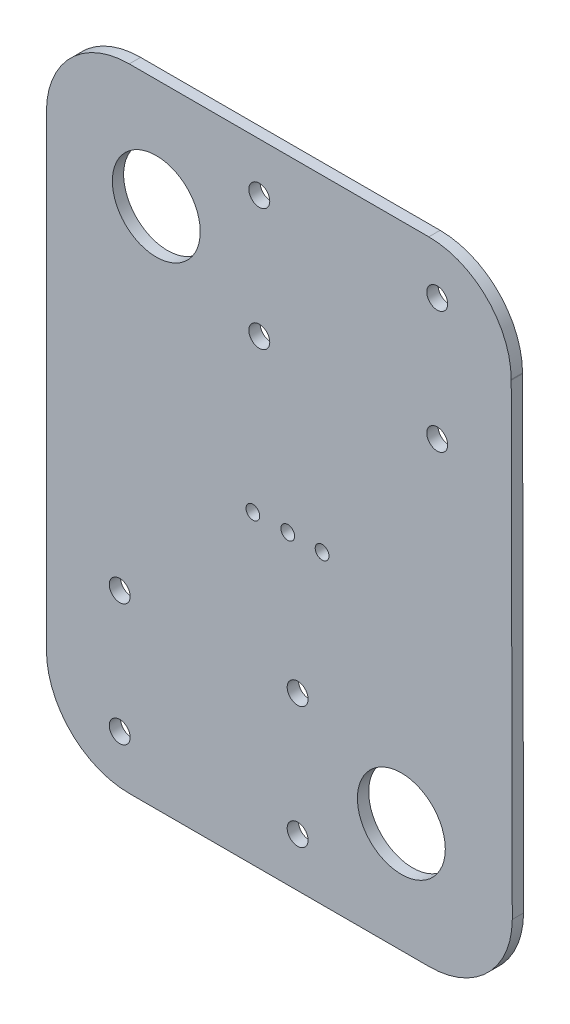
ISO-10303-21;
HEADER;
FILE_DESCRIPTION(('STEP AP214'),'2;1');
FILE_NAME('part.step','',(''),(''),'','','');
FILE_SCHEMA(('AUTOMOTIVE_DESIGN { 1 0 10303 214 1 1 1 1 }'));
ENDSEC;
DATA;
#1=APPLICATION_CONTEXT('core data for automotive mechanical design processes');
#2=APPLICATION_PROTOCOL_DEFINITION('international standard','automotive_design',2000,#1);
#3=PRODUCT_CONTEXT('',#1,'mechanical');
#4=PRODUCT('Part','Part','',(#3));
#5=PRODUCT_RELATED_PRODUCT_CATEGORY('part','',(#4));
#6=PRODUCT_DEFINITION_FORMATION('','',#4);
#7=PRODUCT_DEFINITION_CONTEXT('part definition',#1,'design');
#8=PRODUCT_DEFINITION('design','',#6,#7);
#9=PRODUCT_DEFINITION_SHAPE('','',#8);
#10=(LENGTH_UNIT() NAMED_UNIT(*) SI_UNIT(.MILLI.,.METRE.));
#11=(NAMED_UNIT(*) PLANE_ANGLE_UNIT() SI_UNIT($,.RADIAN.));
#12=(NAMED_UNIT(*) SI_UNIT($,.STERADIAN.) SOLID_ANGLE_UNIT());
#13=UNCERTAINTY_MEASURE_WITH_UNIT(LENGTH_MEASURE(1.E-05),#10,'distance_accuracy_value','');
#14=(GEOMETRIC_REPRESENTATION_CONTEXT(3) GLOBAL_UNCERTAINTY_ASSIGNED_CONTEXT((#13)) GLOBAL_UNIT_ASSIGNED_CONTEXT((#10,
#11,#12)) REPRESENTATION_CONTEXT('',''));
#15=CARTESIAN_POINT('',(0.,0.,0.));
#16=DIRECTION('',(0.,0.,1.));
#17=DIRECTION('',(1.,0.,0.));
#18=AXIS2_PLACEMENT_3D('',#15,#16,#17);
#19=CARTESIAN_POINT('',(16.332373055291,44.01836387923,-0.41148));
#20=DIRECTION('',(0.,0.,-1.));
#21=DIRECTION('',(0.999991562524806,-0.0041079044775982,0.));
#22=AXIS2_PLACEMENT_3D('',#19,#20,#21);
#23=CYLINDRICAL_SURFACE('',#22,3.009651392523);
#24=DIRECTION('',(0.,0.,-1.));
#25=VECTOR('',#24,1.);
#26=CARTESIAN_POINT('',(19.341999053955,44.0307272396701,-0.41148));
#27=LINE('',#26,#25);
#28=CARTESIAN_POINT('',(19.341999053955,44.0307272396701,-0.41148));
#29=VERTEX_POINT('',#28);
#30=CARTESIAN_POINT('',(19.341999053955,44.0307272396701,0.));
#31=VERTEX_POINT('',#30);
#32=EDGE_CURVE('E186',#29,#31,#27,.F.);
#33=ORIENTED_EDGE('',*,*,#32,.F.);
#34=CARTESIAN_POINT('',(16.332373055291,44.01836387923,-0.41148));
#35=DIRECTION('',(0.,0.,1.));
#36=DIRECTION('',(0.999991562524806,-0.0041079044775982,0.));
#37=AXIS2_PLACEMENT_3D('',#34,#35,#36);
#38=CIRCLE('',#37,3.009651392523);
#39=CARTESIAN_POINT('',(16.341999053955,47.02799987793,-0.41148));
#40=VERTEX_POINT('',#39);
#41=EDGE_CURVE('E11',#29,#40,#38,.T.);
#42=ORIENTED_EDGE('',*,*,#41,.T.);
#43=DIRECTION('',(0.,0.,1.));
#44=VECTOR('',#43,1.);
#45=CARTESIAN_POINT('',(16.341999053955,47.02799987793,-0.41148));
#46=LINE('',#45,#44);
#47=CARTESIAN_POINT('',(16.341999053955,47.02799987793,0.));
#48=VERTEX_POINT('',#47);
#49=EDGE_CURVE('E48',#40,#48,#46,.T.);
#50=ORIENTED_EDGE('',*,*,#49,.T.);
#51=CARTESIAN_POINT('',(16.332373055291,44.01836387923,0.));
#52=DIRECTION('',(0.,0.,1.));
#53=DIRECTION('',(0.999991562524806,-0.0041079044775982,0.));
#54=AXIS2_PLACEMENT_3D('',#51,#52,#53);
#55=CIRCLE('',#54,3.009651392523);
#56=EDGE_CURVE('E199',#31,#48,#55,.T.);
#57=ORIENTED_EDGE('',*,*,#56,.F.);
#58=EDGE_LOOP('',(#33,#42,#50,#57));
#59=FACE_BOUND('',#58,.T.);
#60=ADVANCED_FACE('F38',(#59),#23,.T.);
#61=CARTESIAN_POINT('',(16.341999053955,47.02799987793,-0.41148));
#62=DIRECTION('',(0.,-1.,0.));
#63=DIRECTION('',(0.,0.,-1.));
#64=AXIS2_PLACEMENT_3D('',#61,#62,#63);
#65=PLANE('',#64);
#66=DIRECTION('',(-1.,0.,0.));
#67=VECTOR('',#66,1.);
#68=CARTESIAN_POINT('',(16.341999053955,47.02799987793,-0.41148));
#69=LINE('',#68,#67);
#70=CARTESIAN_POINT('',(5.438000202179,47.02799987793,-0.41148));
#71=VERTEX_POINT('',#70);
#72=EDGE_CURVE('E261',#40,#71,#69,.T.);
#73=ORIENTED_EDGE('',*,*,#72,.T.);
#74=DIRECTION('',(0.,0.,1.));
#75=VECTOR('',#74,1.);
#76=CARTESIAN_POINT('',(5.438000202179,47.02799987793,-0.41148));
#77=LINE('',#76,#75);
#78=CARTESIAN_POINT('',(5.438000202179,47.02799987793,0.));
#79=VERTEX_POINT('',#78);
#80=EDGE_CURVE('E264',#71,#79,#77,.T.);
#81=ORIENTED_EDGE('',*,*,#80,.T.);
#82=DIRECTION('',(-1.,0.,0.));
#83=VECTOR('',#82,1.);
#84=CARTESIAN_POINT('',(16.341999053955,47.02799987793,0.));
#85=LINE('',#84,#83);
#86=EDGE_CURVE('E204',#48,#79,#85,.T.);
#87=ORIENTED_EDGE('',*,*,#86,.F.);
#88=ORIENTED_EDGE('',*,*,#49,.F.);
#89=EDGE_LOOP('',(#73,#81,#87,#88));
#90=FACE_BOUND('',#89,.T.);
#91=ADVANCED_FACE('F405',(#90),#65,.F.);
#92=CARTESIAN_POINT('',(5.431629592212,44.018374776933,-0.41148));
#93=DIRECTION('',(0.,0.,-1.));
#94=DIRECTION('',(0.00211674061762714,0.999997759702069,0.));
#95=AXIS2_PLACEMENT_3D('',#92,#93,#94);
#96=CYLINDRICAL_SURFACE('',#95,3.009631843469);
#97=CARTESIAN_POINT('',(5.431629592212,44.018374776933,-0.41148));
#98=DIRECTION('',(0.,0.,1.));
#99=DIRECTION('',(0.00211674061762714,0.999997759702069,0.));
#100=AXIS2_PLACEMENT_3D('',#97,#98,#99);
#101=CIRCLE('',#100,3.009631843469);
#102=CARTESIAN_POINT('',(2.421999931335,44.021999359131,-0.41148));
#103=VERTEX_POINT('',#102);
#104=EDGE_CURVE('E247',#71,#103,#101,.T.);
#105=ORIENTED_EDGE('',*,*,#104,.T.);
#106=DIRECTION('',(0.,0.,1.));
#107=VECTOR('',#106,1.);
#108=CARTESIAN_POINT('',(2.421999931335,44.021999359131,-0.41148));
#109=LINE('',#108,#107);
#110=CARTESIAN_POINT('',(2.421999931335,44.021999359131,0.));
#111=VERTEX_POINT('',#110);
#112=EDGE_CURVE('E244',#103,#111,#109,.T.);
#113=ORIENTED_EDGE('',*,*,#112,.T.);
#114=CARTESIAN_POINT('',(5.431629592212,44.018374776933,0.));
#115=DIRECTION('',(0.,0.,1.));
#116=DIRECTION('',(0.00211674061762714,0.999997759702069,0.));
#117=AXIS2_PLACEMENT_3D('',#114,#115,#116);
#118=CIRCLE('',#117,3.009631843469);
#119=EDGE_CURVE('E206',#79,#111,#118,.T.);
#120=ORIENTED_EDGE('',*,*,#119,.F.);
#121=ORIENTED_EDGE('',*,*,#80,.F.);
#122=EDGE_LOOP('',(#105,#113,#120,#121));
#123=FACE_BOUND('',#122,.T.);
#124=ADVANCED_FACE('F410',(#123),#96,.T.);
#125=CARTESIAN_POINT('',(2.421999931335,44.021999359131,-0.41148));
#126=DIRECTION('',(1.,0.,0.));
#127=DIRECTION('',(0.,1.,0.));
#128=AXIS2_PLACEMENT_3D('',#125,#126,#127);
#129=PLANE('',#128);
#130=DIRECTION('',(0.,-1.,0.));
#131=VECTOR('',#130,1.);
#132=CARTESIAN_POINT('',(2.421999931335,44.021999359131,-0.41148));
#133=LINE('',#132,#131);
#134=CARTESIAN_POINT('',(2.421999931335,27.051000595093,-0.41148));
#135=VERTEX_POINT('',#134);
#136=EDGE_CURVE('E248',#103,#135,#133,.T.);
#137=ORIENTED_EDGE('',*,*,#136,.T.);
#138=DIRECTION('',(0.,0.,1.));
#139=VECTOR('',#138,1.);
#140=CARTESIAN_POINT('',(2.421999931335,27.051000595093,-0.41148));
#141=LINE('',#140,#139);
#142=CARTESIAN_POINT('',(2.421999931335,27.051000595093,0.));
#143=VERTEX_POINT('',#142);
#144=EDGE_CURVE('E224',#135,#143,#141,.T.);
#145=ORIENTED_EDGE('',*,*,#144,.T.);
#146=DIRECTION('',(0.,-1.,0.));
#147=VECTOR('',#146,1.);
#148=CARTESIAN_POINT('',(2.421999931335,44.021999359131,0.));
#149=LINE('',#148,#147);
#150=EDGE_CURVE('E304',#111,#143,#149,.T.);
#151=ORIENTED_EDGE('',*,*,#150,.F.);
#152=ORIENTED_EDGE('',*,*,#112,.F.);
#153=EDGE_LOOP('',(#137,#145,#151,#152));
#154=FACE_BOUND('',#153,.T.);
#155=ADVANCED_FACE('F422',(#154),#129,.F.);
#156=CARTESIAN_POINT('',(5.433336476187,27.03933766917,-0.41148));
#157=DIRECTION('',(0.,0.,-1.));
#158=DIRECTION('',(-0.999992499994815,0.00387297742299429,0.));
#159=AXIS2_PLACEMENT_3D('',#156,#157,#158);
#160=CYLINDRICAL_SURFACE('',#159,3.01135913006);
#161=CARTESIAN_POINT('',(5.433336476187,27.03933766917,-0.41148));
#162=DIRECTION('',(0.,0.,1.));
#163=DIRECTION('',(-0.999992499994815,0.00387297742299429,0.));
#164=AXIS2_PLACEMENT_3D('',#161,#162,#163);
#165=CIRCLE('',#164,3.01135913006);
#166=CARTESIAN_POINT('',(5.421999931335,24.02799987793,-0.41148));
#167=VERTEX_POINT('',#166);
#168=EDGE_CURVE('E221',#135,#167,#165,.T.);
#169=ORIENTED_EDGE('',*,*,#168,.T.);
#170=DIRECTION('',(0.,0.,1.));
#171=VECTOR('',#170,1.);
#172=CARTESIAN_POINT('',(5.421999931335,24.02799987793,-0.41148));
#173=LINE('',#172,#171);
#174=CARTESIAN_POINT('',(5.421999931335,24.02799987793,0.));
#175=VERTEX_POINT('',#174);
#176=EDGE_CURVE('E225',#167,#175,#173,.T.);
#177=ORIENTED_EDGE('',*,*,#176,.T.);
#178=CARTESIAN_POINT('',(5.433336476187,27.03933766917,0.));
#179=DIRECTION('',(0.,0.,1.));
#180=DIRECTION('',(-0.999992499994815,0.00387297742299429,0.));
#181=AXIS2_PLACEMENT_3D('',#178,#179,#180);
#182=CIRCLE('',#181,3.01135913006);
#183=EDGE_CURVE('E306',#143,#175,#182,.T.);
#184=ORIENTED_EDGE('',*,*,#183,.F.);
#185=ORIENTED_EDGE('',*,*,#144,.F.);
#186=EDGE_LOOP('',(#169,#177,#184,#185));
#187=FACE_BOUND('',#186,.T.);
#188=ADVANCED_FACE('F425',(#187),#160,.T.);
#189=CARTESIAN_POINT('',(5.421999931335,24.02799987793,-0.41148));
#190=DIRECTION('',(0.,1.,0.));
#191=DIRECTION('',(1.,0.,0.));
#192=AXIS2_PLACEMENT_3D('',#189,#190,#191);
#193=PLANE('',#192);
#194=DIRECTION('',(1.,0.,0.));
#195=VECTOR('',#194,1.);
#196=CARTESIAN_POINT('',(5.421999931335,24.02799987793,-0.41148));
#197=LINE('',#196,#195);
#198=CARTESIAN_POINT('',(16.341999053955,24.02799987793,-0.41148));
#199=VERTEX_POINT('',#198);
#200=EDGE_CURVE('E219',#167,#199,#197,.T.);
#201=ORIENTED_EDGE('',*,*,#200,.T.);
#202=DIRECTION('',(0.,0.,1.));
#203=VECTOR('',#202,1.);
#204=CARTESIAN_POINT('',(16.341999053955,24.02799987793,-0.41148));
#205=LINE('',#204,#203);
#206=CARTESIAN_POINT('',(16.341999053955,24.02799987793,0.));
#207=VERTEX_POINT('',#206);
#208=EDGE_CURVE('E216',#199,#207,#205,.T.);
#209=ORIENTED_EDGE('',*,*,#208,.T.);
#210=DIRECTION('',(1.,0.,0.));
#211=VECTOR('',#210,1.);
#212=CARTESIAN_POINT('',(5.421999931335,24.02799987793,0.));
#213=LINE('',#212,#211);
#214=EDGE_CURVE('E297',#175,#207,#213,.T.);
#215=ORIENTED_EDGE('',*,*,#214,.F.);
#216=ORIENTED_EDGE('',*,*,#176,.F.);
#217=EDGE_LOOP('',(#201,#209,#215,#216));
#218=FACE_BOUND('',#217,.T.);
#219=ADVANCED_FACE('F459',(#218),#193,.F.);
#220=CARTESIAN_POINT('',(16.360135387178,27.047874592005,-0.41148));
#221=DIRECTION('',(0.,0.,-1.));
#222=DIRECTION('',(-0.00600554919627793,-0.999981966526823,0.));
#223=AXIS2_PLACEMENT_3D('',#220,#221,#222);
#224=CYLINDRICAL_SURFACE('',#223,3.019929173887);
#225=CARTESIAN_POINT('',(16.360135387178,27.047874592005,-0.41148));
#226=DIRECTION('',(0.,0.,1.));
#227=DIRECTION('',(-0.00600554919627793,-0.999981966526823,0.));
#228=AXIS2_PLACEMENT_3D('',#225,#226,#227);
#229=CIRCLE('',#228,3.019929173887);
#230=CARTESIAN_POINT('',(19.379999160767,27.02799987793,-0.41148));
#231=VERTEX_POINT('',#230);
#232=EDGE_CURVE('E220',#199,#231,#229,.T.);
#233=ORIENTED_EDGE('',*,*,#232,.T.);
#234=DIRECTION('',(0.,0.,1.));
#235=VECTOR('',#234,1.);
#236=CARTESIAN_POINT('',(19.379999160767,27.02799987793,-0.41148));
#237=LINE('',#236,#235);
#238=CARTESIAN_POINT('',(19.379999160767,27.02799987793,0.));
#239=VERTEX_POINT('',#238);
#240=EDGE_CURVE('E233',#231,#239,#237,.T.);
#241=ORIENTED_EDGE('',*,*,#240,.T.);
#242=CARTESIAN_POINT('',(16.360135387178,27.047874592005,0.));
#243=DIRECTION('',(0.,0.,1.));
#244=DIRECTION('',(-0.00600554919627793,-0.999981966526823,0.));
#245=AXIS2_PLACEMENT_3D('',#242,#243,#244);
#246=CIRCLE('',#245,3.019929173887);
#247=EDGE_CURVE('E214',#207,#239,#246,.T.);
#248=ORIENTED_EDGE('',*,*,#247,.F.);
#249=ORIENTED_EDGE('',*,*,#208,.F.);
#250=EDGE_LOOP('',(#233,#241,#248,#249));
#251=FACE_BOUND('',#250,.T.);
#252=ADVANCED_FACE('F415',(#251),#224,.T.);
#253=CARTESIAN_POINT('',(5.09069086,25.80836342,-0.41148));
#254=DIRECTION('',(0.,0.,-1.));
#255=DIRECTION('',(1.,0.,0.));
#256=AXIS2_PLACEMENT_3D('',#253,#254,#255);
#257=CYLINDRICAL_SURFACE('',#256,0.381);
#258=DIRECTION('',(0.,0.,1.));
#259=VECTOR('',#258,1.);
#260=CARTESIAN_POINT('',(5.47169086,25.80836342,-0.41148));
#261=LINE('',#260,#259);
#262=CARTESIAN_POINT('',(5.47169086,25.80836342,-0.41148));
#263=VERTEX_POINT('',#262);
#264=CARTESIAN_POINT('',(5.47169086,25.80836342,0.));
#265=VERTEX_POINT('',#264);
#266=EDGE_CURVE('E229',#263,#265,#261,.T.);
#267=ORIENTED_EDGE('',*,*,#266,.T.);
#268=CARTESIAN_POINT('',(5.09069086,25.80836342,0.));
#269=DIRECTION('',(0.,0.,1.));
#270=DIRECTION('',(1.,0.,0.));
#271=AXIS2_PLACEMENT_3D('',#268,#269,#270);
#272=CIRCLE('',#271,0.381);
#273=EDGE_CURVE('E226',#265,#265,#272,.T.);
#274=ORIENTED_EDGE('',*,*,#273,.T.);
#275=ORIENTED_EDGE('',*,*,#266,.F.);
#276=CARTESIAN_POINT('',(5.09069086,25.80836342,-0.41148));
#277=DIRECTION('',(0.,0.,1.));
#278=DIRECTION('',(1.,0.,0.));
#279=AXIS2_PLACEMENT_3D('',#276,#277,#278);
#280=CIRCLE('',#279,0.381);
#281=EDGE_CURVE('E272',#263,#263,#280,.T.);
#282=ORIENTED_EDGE('',*,*,#281,.F.);
#283=EDGE_LOOP('',(#267,#274,#275,#282));
#284=FACE_BOUND('',#283,.T.);
#285=ADVANCED_FACE('F40',(#284),#257,.F.);
#286=CARTESIAN_POINT('',(11.56769086,25.80836342,-0.41148));
#287=DIRECTION('',(0.,0.,-1.));
#288=DIRECTION('',(1.,0.,0.));
#289=AXIS2_PLACEMENT_3D('',#286,#287,#288);
#290=CYLINDRICAL_SURFACE('',#289,0.381);
#291=DIRECTION('',(0.,0.,1.));
#292=VECTOR('',#291,1.);
#293=CARTESIAN_POINT('',(11.94869086,25.80836342,-0.41148));
#294=LINE('',#293,#292);
#295=CARTESIAN_POINT('',(11.94869086,25.80836342,-0.41148));
#296=VERTEX_POINT('',#295);
#297=CARTESIAN_POINT('',(11.94869086,25.80836342,0.));
#298=VERTEX_POINT('',#297);
#299=EDGE_CURVE('E230',#296,#298,#294,.T.);
#300=ORIENTED_EDGE('',*,*,#299,.T.);
#301=CARTESIAN_POINT('',(11.56769086,25.80836342,0.));
#302=DIRECTION('',(0.,0.,1.));
#303=DIRECTION('',(1.,0.,0.));
#304=AXIS2_PLACEMENT_3D('',#301,#302,#303);
#305=CIRCLE('',#304,0.381);
#306=EDGE_CURVE('E318',#298,#298,#305,.T.);
#307=ORIENTED_EDGE('',*,*,#306,.T.);
#308=ORIENTED_EDGE('',*,*,#299,.F.);
#309=CARTESIAN_POINT('',(11.56769086,25.80836342,-0.41148));
#310=DIRECTION('',(0.,0.,1.));
#311=DIRECTION('',(1.,0.,0.));
#312=AXIS2_PLACEMENT_3D('',#309,#310,#311);
#313=CIRCLE('',#312,0.381);
#314=EDGE_CURVE('E276',#296,#296,#313,.T.);
#315=ORIENTED_EDGE('',*,*,#314,.F.);
#316=EDGE_LOOP('',(#300,#307,#308,#315));
#317=FACE_BOUND('',#316,.T.);
#318=ADVANCED_FACE('F431',(#317),#290,.F.);
#319=CARTESIAN_POINT('',(15.3416889,28.02836406,-0.41148));
#320=DIRECTION('',(0.,0.,-1.));
#321=DIRECTION('',(1.,0.,0.));
#322=AXIS2_PLACEMENT_3D('',#319,#320,#321);
#323=CYLINDRICAL_SURFACE('',#322,1.59999934);
#324=DIRECTION('',(0.,0.,1.));
#325=VECTOR('',#324,1.);
#326=CARTESIAN_POINT('',(16.94168824,28.02836406,-0.41148));
#327=LINE('',#326,#325);
#328=CARTESIAN_POINT('',(16.94168824,28.02836406,-0.41148));
#329=VERTEX_POINT('',#328);
#330=CARTESIAN_POINT('',(16.94168824,28.02836406,0.));
#331=VERTEX_POINT('',#330);
#332=EDGE_CURVE('E242',#329,#331,#327,.T.);
#333=ORIENTED_EDGE('',*,*,#332,.T.);
#334=CARTESIAN_POINT('',(15.3416889,28.02836406,0.));
#335=DIRECTION('',(0.,0.,1.));
#336=DIRECTION('',(1.,0.,0.));
#337=AXIS2_PLACEMENT_3D('',#334,#335,#336);
#338=CIRCLE('',#337,1.59999934);
#339=EDGE_CURVE('E239',#331,#331,#338,.T.);
#340=ORIENTED_EDGE('',*,*,#339,.T.);
#341=ORIENTED_EDGE('',*,*,#332,.F.);
#342=CARTESIAN_POINT('',(15.3416889,28.02836406,-0.41148));
#343=DIRECTION('',(0.,0.,1.));
#344=DIRECTION('',(1.,0.,0.));
#345=AXIS2_PLACEMENT_3D('',#342,#343,#344);
#346=CIRCLE('',#345,1.59999934);
#347=EDGE_CURVE('E283',#329,#329,#346,.T.);
#348=ORIENTED_EDGE('',*,*,#347,.F.);
#349=EDGE_LOOP('',(#333,#340,#341,#348));
#350=FACE_BOUND('',#349,.T.);
#351=ADVANCED_FACE('F434',(#350),#323,.F.);
#352=CARTESIAN_POINT('',(5.09069086,30.25336342,-0.41148));
#353=DIRECTION('',(0.,0.,-1.));
#354=DIRECTION('',(1.,0.,0.));
#355=AXIS2_PLACEMENT_3D('',#352,#353,#354);
#356=CYLINDRICAL_SURFACE('',#355,0.381);
#357=DIRECTION('',(0.,0.,1.));
#358=VECTOR('',#357,1.);
#359=CARTESIAN_POINT('',(5.47169086,30.25336342,-0.41148));
#360=LINE('',#359,#358);
#361=CARTESIAN_POINT('',(5.47169086,30.25336342,-0.41148));
#362=VERTEX_POINT('',#361);
#363=CARTESIAN_POINT('',(5.47169086,30.25336342,0.));
#364=VERTEX_POINT('',#363);
#365=EDGE_CURVE('E243',#362,#364,#360,.T.);
#366=ORIENTED_EDGE('',*,*,#365,.T.);
#367=CARTESIAN_POINT('',(5.09069086,30.25336342,0.));
#368=DIRECTION('',(0.,0.,1.));
#369=DIRECTION('',(1.,0.,0.));
#370=AXIS2_PLACEMENT_3D('',#367,#368,#369);
#371=CIRCLE('',#370,0.381);
#372=EDGE_CURVE('E301',#364,#364,#371,.T.);
#373=ORIENTED_EDGE('',*,*,#372,.T.);
#374=ORIENTED_EDGE('',*,*,#365,.F.);
#375=CARTESIAN_POINT('',(5.09069086,30.25336342,-0.41148));
#376=DIRECTION('',(0.,0.,1.));
#377=DIRECTION('',(1.,0.,0.));
#378=AXIS2_PLACEMENT_3D('',#375,#376,#377);
#379=CIRCLE('',#378,0.381);
#380=EDGE_CURVE('E300',#362,#362,#379,.T.);
#381=ORIENTED_EDGE('',*,*,#380,.F.);
#382=EDGE_LOOP('',(#366,#373,#374,#381));
#383=FACE_BOUND('',#382,.T.);
#384=ADVANCED_FACE('F436',(#383),#356,.F.);
#385=CARTESIAN_POINT('',(11.56769086,30.25336342,-0.41148));
#386=DIRECTION('',(0.,0.,-1.));
#387=DIRECTION('',(1.,0.,0.));
#388=AXIS2_PLACEMENT_3D('',#385,#386,#387);
#389=CYLINDRICAL_SURFACE('',#388,0.381);
#390=DIRECTION('',(0.,0.,1.));
#391=VECTOR('',#390,1.);
#392=CARTESIAN_POINT('',(11.94869086,30.25336342,-0.41148));
#393=LINE('',#392,#391);
#394=CARTESIAN_POINT('',(11.94869086,30.25336342,-0.41148));
#395=VERTEX_POINT('',#394);
#396=CARTESIAN_POINT('',(11.94869086,30.25336342,0.));
#397=VERTEX_POINT('',#396);
#398=EDGE_CURVE('E209',#395,#397,#393,.T.);
#399=ORIENTED_EDGE('',*,*,#398,.T.);
#400=CARTESIAN_POINT('',(11.56769086,30.25336342,0.));
#401=DIRECTION('',(0.,0.,1.));
#402=DIRECTION('',(1.,0.,0.));
#403=AXIS2_PLACEMENT_3D('',#400,#401,#402);
#404=CIRCLE('',#403,0.381);
#405=EDGE_CURVE('E324',#397,#397,#404,.T.);
#406=ORIENTED_EDGE('',*,*,#405,.T.);
#407=ORIENTED_EDGE('',*,*,#398,.F.);
#408=CARTESIAN_POINT('',(11.56769086,30.25336342,-0.41148));
#409=DIRECTION('',(0.,0.,1.));
#410=DIRECTION('',(1.,0.,0.));
#411=AXIS2_PLACEMENT_3D('',#408,#409,#410);
#412=CIRCLE('',#411,0.381);
#413=EDGE_CURVE('E335',#395,#395,#412,.T.);
#414=ORIENTED_EDGE('',*,*,#413,.F.);
#415=EDGE_LOOP('',(#399,#406,#407,#414));
#416=FACE_BOUND('',#415,.T.);
#417=ADVANCED_FACE('F439',(#416),#389,.F.);
#418=CARTESIAN_POINT('',(9.9370896,35.14436456,-0.41148));
#419=DIRECTION('',(0.,0.,-1.));
#420=DIRECTION('',(1.,0.,0.));
#421=AXIS2_PLACEMENT_3D('',#418,#419,#420);
#422=CYLINDRICAL_SURFACE('',#421,0.2499995);
#423=DIRECTION('',(0.,0.,1.));
#424=VECTOR('',#423,1.);
#425=CARTESIAN_POINT('',(10.1870891,35.14436456,-0.41148));
#426=LINE('',#425,#424);
#427=CARTESIAN_POINT('',(10.1870891,35.14436456,-0.41148));
#428=VERTEX_POINT('',#427);
#429=CARTESIAN_POINT('',(10.1870891,35.14436456,0.));
#430=VERTEX_POINT('',#429);
#431=EDGE_CURVE('E321',#428,#430,#426,.T.);
#432=ORIENTED_EDGE('',*,*,#431,.T.);
#433=CARTESIAN_POINT('',(9.9370896,35.14436456,0.));
#434=DIRECTION('',(0.,0.,1.));
#435=DIRECTION('',(1.,0.,0.));
#436=AXIS2_PLACEMENT_3D('',#433,#434,#435);
#437=CIRCLE('',#436,0.2499995);
#438=EDGE_CURVE('E287',#430,#430,#437,.T.);
#439=ORIENTED_EDGE('',*,*,#438,.T.);
#440=ORIENTED_EDGE('',*,*,#431,.F.);
#441=CARTESIAN_POINT('',(9.9370896,35.14436456,-0.41148));
#442=DIRECTION('',(0.,0.,1.));
#443=DIRECTION('',(1.,0.,0.));
#444=AXIS2_PLACEMENT_3D('',#441,#442,#443);
#445=CIRCLE('',#444,0.2499995);
#446=EDGE_CURVE('E294',#428,#428,#445,.T.);
#447=ORIENTED_EDGE('',*,*,#446,.F.);
#448=EDGE_LOOP('',(#432,#439,#440,#447));
#449=FACE_BOUND('',#448,.T.);
#450=ADVANCED_FACE('F377',(#449),#422,.F.);
#451=CARTESIAN_POINT('',(11.2070896,35.14436456,-0.41148));
#452=DIRECTION('',(0.,0.,-1.));
#453=DIRECTION('',(1.,0.,0.));
#454=AXIS2_PLACEMENT_3D('',#451,#452,#453);
#455=CYLINDRICAL_SURFACE('',#454,0.2499995);
#456=DIRECTION('',(0.,0.,1.));
#457=VECTOR('',#456,1.);
#458=CARTESIAN_POINT('',(11.4570891,35.14436456,-0.41148));
#459=LINE('',#458,#457);
#460=CARTESIAN_POINT('',(11.4570891,35.14436456,-0.41148));
#461=VERTEX_POINT('',#460);
#462=CARTESIAN_POINT('',(11.4570891,35.14436456,0.));
#463=VERTEX_POINT('',#462);
#464=EDGE_CURVE('E284',#461,#463,#459,.T.);
#465=ORIENTED_EDGE('',*,*,#464,.T.);
#466=CARTESIAN_POINT('',(11.2070896,35.14436456,0.));
#467=DIRECTION('',(0.,0.,1.));
#468=DIRECTION('',(1.,0.,0.));
#469=AXIS2_PLACEMENT_3D('',#466,#467,#468);
#470=CIRCLE('',#469,0.2499995);
#471=EDGE_CURVE('E288',#463,#463,#470,.T.);
#472=ORIENTED_EDGE('',*,*,#471,.T.);
#473=ORIENTED_EDGE('',*,*,#464,.F.);
#474=CARTESIAN_POINT('',(11.2070896,35.14436456,-0.41148));
#475=DIRECTION('',(0.,0.,1.));
#476=DIRECTION('',(1.,0.,0.));
#477=AXIS2_PLACEMENT_3D('',#474,#475,#476);
#478=CIRCLE('',#477,0.2499995);
#479=EDGE_CURVE('E291',#461,#461,#478,.T.);
#480=ORIENTED_EDGE('',*,*,#479,.F.);
#481=EDGE_LOOP('',(#465,#472,#473,#480));
#482=FACE_BOUND('',#481,.T.);
#483=ADVANCED_FACE('F429',(#482),#455,.F.);
#484=CARTESIAN_POINT('',(12.45708964,35.14436456,-0.41148));
#485=DIRECTION('',(0.,0.,-1.));
#486=DIRECTION('',(1.,0.,0.));
#487=AXIS2_PLACEMENT_3D('',#484,#485,#486);
#488=CYLINDRICAL_SURFACE('',#487,0.2499995);
#489=DIRECTION('',(0.,0.,1.));
#490=VECTOR('',#489,1.);
#491=CARTESIAN_POINT('',(12.70708914,35.14436456,-0.41148));
#492=LINE('',#491,#490);
#493=CARTESIAN_POINT('',(12.70708914,35.14436456,-0.41148));
#494=VERTEX_POINT('',#493);
#495=CARTESIAN_POINT('',(12.70708914,35.14436456,0.));
#496=VERTEX_POINT('',#495);
#497=EDGE_CURVE('E307',#494,#496,#492,.T.);
#498=ORIENTED_EDGE('',*,*,#497,.T.);
#499=CARTESIAN_POINT('',(12.45708964,35.14436456,0.));
#500=DIRECTION('',(0.,0.,1.));
#501=DIRECTION('',(1.,0.,0.));
#502=AXIS2_PLACEMENT_3D('',#499,#500,#501);
#503=CIRCLE('',#502,0.2499995);
#504=EDGE_CURVE('E257',#496,#496,#503,.T.);
#505=ORIENTED_EDGE('',*,*,#504,.T.);
#506=ORIENTED_EDGE('',*,*,#497,.F.);
#507=CARTESIAN_POINT('',(12.45708964,35.14436456,-0.41148));
#508=DIRECTION('',(0.,0.,1.));
#509=DIRECTION('',(1.,0.,0.));
#510=AXIS2_PLACEMENT_3D('',#507,#508,#509);
#511=CIRCLE('',#510,0.2499995);
#512=EDGE_CURVE('E295',#494,#494,#511,.T.);
#513=ORIENTED_EDGE('',*,*,#512,.F.);
#514=EDGE_LOOP('',(#498,#505,#506,#513));
#515=FACE_BOUND('',#514,.T.);
#516=ADVANCED_FACE('F420',(#515),#488,.F.);
#517=CARTESIAN_POINT('',(10.17108964,40.80856456,-0.41148));
#518=DIRECTION('',(0.,0.,-1.));
#519=DIRECTION('',(1.,0.,0.));
#520=AXIS2_PLACEMENT_3D('',#517,#518,#519);
#521=CYLINDRICAL_SURFACE('',#520,0.381);
#522=DIRECTION('',(0.,0.,1.));
#523=VECTOR('',#522,1.);
#524=CARTESIAN_POINT('',(10.55208964,40.80856456,-0.41148));
#525=LINE('',#524,#523);
#526=CARTESIAN_POINT('',(10.55208964,40.80856456,-0.41148));
#527=VERTEX_POINT('',#526);
#528=CARTESIAN_POINT('',(10.55208964,40.80856456,0.));
#529=VERTEX_POINT('',#528);
#530=EDGE_CURVE('E254',#527,#529,#525,.T.);
#531=ORIENTED_EDGE('',*,*,#530,.T.);
#532=CARTESIAN_POINT('',(10.17108964,40.80856456,0.));
#533=DIRECTION('',(0.,0.,1.));
#534=DIRECTION('',(1.,0.,0.));
#535=AXIS2_PLACEMENT_3D('',#532,#533,#534);
#536=CIRCLE('',#535,0.381);
#537=EDGE_CURVE('E258',#529,#529,#536,.T.);
#538=ORIENTED_EDGE('',*,*,#537,.T.);
#539=ORIENTED_EDGE('',*,*,#530,.F.);
#540=CARTESIAN_POINT('',(10.17108964,40.80856456,-0.41148));
#541=DIRECTION('',(0.,0.,1.));
#542=DIRECTION('',(1.,0.,0.));
#543=AXIS2_PLACEMENT_3D('',#540,#541,#542);
#544=CIRCLE('',#543,0.381);
#545=EDGE_CURVE('E312',#527,#527,#544,.T.);
#546=ORIENTED_EDGE('',*,*,#545,.F.);
#547=EDGE_LOOP('',(#531,#538,#539,#546));
#548=FACE_BOUND('',#547,.T.);
#549=ADVANCED_FACE('F416',(#548),#521,.F.);
#550=CARTESIAN_POINT('',(16.64808964,40.80856456,-0.41148));
#551=DIRECTION('',(0.,0.,-1.));
#552=DIRECTION('',(1.,0.,0.));
#553=AXIS2_PLACEMENT_3D('',#550,#551,#552);
#554=CYLINDRICAL_SURFACE('',#553,0.381);
#555=DIRECTION('',(0.,0.,1.));
#556=VECTOR('',#555,1.);
#557=CARTESIAN_POINT('',(17.02908964,40.80856456,-0.41148));
#558=LINE('',#557,#556);
#559=CARTESIAN_POINT('',(17.02908964,40.80856456,-0.41148));
#560=VERTEX_POINT('',#559);
#561=CARTESIAN_POINT('',(17.02908964,40.80856456,0.));
#562=VERTEX_POINT('',#561);
#563=EDGE_CURVE('E237',#560,#562,#558,.T.);
#564=ORIENTED_EDGE('',*,*,#563,.T.);
#565=CARTESIAN_POINT('',(16.64808964,40.80856456,0.));
#566=DIRECTION('',(0.,0.,1.));
#567=DIRECTION('',(1.,0.,0.));
#568=AXIS2_PLACEMENT_3D('',#565,#566,#567);
#569=CIRCLE('',#568,0.381);
#570=EDGE_CURVE('E234',#562,#562,#569,.T.);
#571=ORIENTED_EDGE('',*,*,#570,.T.);
#572=ORIENTED_EDGE('',*,*,#563,.F.);
#573=CARTESIAN_POINT('',(16.64808964,40.80856456,-0.41148));
#574=DIRECTION('',(0.,0.,1.));
#575=DIRECTION('',(1.,0.,0.));
#576=AXIS2_PLACEMENT_3D('',#573,#574,#575);
#577=CIRCLE('',#576,0.381);
#578=EDGE_CURVE('E315',#560,#560,#577,.T.);
#579=ORIENTED_EDGE('',*,*,#578,.F.);
#580=EDGE_LOOP('',(#564,#571,#572,#579));
#581=FACE_BOUND('',#580,.T.);
#582=ADVANCED_FACE('F419',(#581),#554,.F.);
#583=CARTESIAN_POINT('',(6.42168896,43.02836454,-0.41148));
#584=DIRECTION('',(0.,0.,-1.));
#585=DIRECTION('',(1.,0.,0.));
#586=AXIS2_PLACEMENT_3D('',#583,#584,#585);
#587=CYLINDRICAL_SURFACE('',#586,1.59999934);
#588=DIRECTION('',(0.,0.,1.));
#589=VECTOR('',#588,1.);
#590=CARTESIAN_POINT('',(8.0216883,43.02836454,-0.41148));
#591=LINE('',#590,#589);
#592=CARTESIAN_POINT('',(8.0216883,43.02836454,-0.41148));
#593=VERTEX_POINT('',#592);
#594=CARTESIAN_POINT('',(8.0216883,43.02836454,0.));
#595=VERTEX_POINT('',#594);
#596=EDGE_CURVE('E238',#593,#595,#591,.T.);
#597=ORIENTED_EDGE('',*,*,#596,.T.);
#598=CARTESIAN_POINT('',(6.42168896,43.02836454,0.));
#599=DIRECTION('',(0.,0.,1.));
#600=DIRECTION('',(1.,0.,0.));
#601=AXIS2_PLACEMENT_3D('',#598,#599,#600);
#602=CIRCLE('',#601,1.59999934);
#603=EDGE_CURVE('E265',#595,#595,#602,.T.);
#604=ORIENTED_EDGE('',*,*,#603,.T.);
#605=ORIENTED_EDGE('',*,*,#596,.F.);
#606=CARTESIAN_POINT('',(6.42168896,43.02836454,-0.41148));
#607=DIRECTION('',(0.,0.,1.));
#608=DIRECTION('',(1.,0.,0.));
#609=AXIS2_PLACEMENT_3D('',#606,#607,#608);
#610=CIRCLE('',#609,1.59999934);
#611=EDGE_CURVE('E271',#593,#593,#610,.T.);
#612=ORIENTED_EDGE('',*,*,#611,.F.);
#613=EDGE_LOOP('',(#597,#604,#605,#612));
#614=FACE_BOUND('',#613,.T.);
#615=ADVANCED_FACE('F453',(#614),#587,.F.);
#616=CARTESIAN_POINT('',(10.17108964,45.25356456,-0.41148));
#617=DIRECTION('',(0.,0.,-1.));
#618=DIRECTION('',(1.,0.,0.));
#619=AXIS2_PLACEMENT_3D('',#616,#617,#618);
#620=CYLINDRICAL_SURFACE('',#619,0.381);
#621=DIRECTION('',(0.,0.,1.));
#622=VECTOR('',#621,1.);
#623=CARTESIAN_POINT('',(10.55208964,45.25356456,-0.41148));
#624=LINE('',#623,#622);
#625=CARTESIAN_POINT('',(10.55208964,45.25356456,-0.41148));
#626=VERTEX_POINT('',#625);
#627=CARTESIAN_POINT('',(10.55208964,45.25356456,0.));
#628=VERTEX_POINT('',#627);
#629=EDGE_CURVE('E267',#626,#628,#624,.T.);
#630=ORIENTED_EDGE('',*,*,#629,.T.);
#631=CARTESIAN_POINT('',(10.17108964,45.25356456,0.));
#632=DIRECTION('',(0.,0.,1.));
#633=DIRECTION('',(1.,0.,0.));
#634=AXIS2_PLACEMENT_3D('',#631,#632,#633);
#635=CIRCLE('',#634,0.381);
#636=EDGE_CURVE('E328',#628,#628,#635,.T.);
#637=ORIENTED_EDGE('',*,*,#636,.T.);
#638=ORIENTED_EDGE('',*,*,#629,.F.);
#639=CARTESIAN_POINT('',(10.17108964,45.25356456,-0.41148));
#640=DIRECTION('',(0.,0.,1.));
#641=DIRECTION('',(1.,0.,0.));
#642=AXIS2_PLACEMENT_3D('',#639,#640,#641);
#643=CIRCLE('',#642,0.381);
#644=EDGE_CURVE('E253',#626,#626,#643,.T.);
#645=ORIENTED_EDGE('',*,*,#644,.F.);
#646=EDGE_LOOP('',(#630,#637,#638,#645));
#647=FACE_BOUND('',#646,.T.);
#648=ADVANCED_FACE('F399',(#647),#620,.F.);
#649=CARTESIAN_POINT('',(16.64808964,45.25356456,-0.41148));
#650=DIRECTION('',(0.,0.,-1.));
#651=DIRECTION('',(1.,0.,0.));
#652=AXIS2_PLACEMENT_3D('',#649,#650,#651);
#653=CYLINDRICAL_SURFACE('',#652,0.381);
#654=DIRECTION('',(0.,0.,1.));
#655=VECTOR('',#654,1.);
#656=CARTESIAN_POINT('',(17.02908964,45.25356456,-0.41148));
#657=LINE('',#656,#655);
#658=CARTESIAN_POINT('',(17.02908964,45.25356456,-0.41148));
#659=VERTEX_POINT('',#658);
#660=CARTESIAN_POINT('',(17.02908964,45.25356456,0.));
#661=VERTEX_POINT('',#660);
#662=EDGE_CURVE('E355',#659,#661,#657,.T.);
#663=ORIENTED_EDGE('',*,*,#662,.T.);
#664=CARTESIAN_POINT('',(16.64808964,45.25356456,0.));
#665=DIRECTION('',(0.,0.,1.));
#666=DIRECTION('',(1.,0.,0.));
#667=AXIS2_PLACEMENT_3D('',#664,#665,#666);
#668=CIRCLE('',#667,0.381);
#669=EDGE_CURVE('E275',#661,#661,#668,.T.);
#670=ORIENTED_EDGE('',*,*,#669,.T.);
#671=ORIENTED_EDGE('',*,*,#662,.F.);
#672=CARTESIAN_POINT('',(16.64808964,45.25356456,-0.41148));
#673=DIRECTION('',(0.,0.,1.));
#674=DIRECTION('',(1.,0.,0.));
#675=AXIS2_PLACEMENT_3D('',#672,#673,#674);
#676=CIRCLE('',#675,0.381);
#677=EDGE_CURVE('E201',#659,#659,#676,.T.);
#678=ORIENTED_EDGE('',*,*,#677,.F.);
#679=EDGE_LOOP('',(#663,#670,#671,#678));
#680=FACE_BOUND('',#679,.T.);
#681=ADVANCED_FACE('F391',(#680),#653,.F.);
#682=CARTESIAN_POINT('',(4.842000007629,3.006000041962,-0.41148));
#683=DIRECTION('',(0.,0.,-1.));
#684=DIRECTION('',(0.,-1.,0.));
#685=AXIS2_PLACEMENT_3D('',#682,#683,#684);
#686=PLANE('',#685);
#687=DIRECTION('',(-0.00223819120018449,0.999997495246939,0.));
#688=VECTOR('',#687,1.);
#689=CARTESIAN_POINT('',(19.433692026636,3.03865912043767,-0.41148));
#690=LINE('',#689,#688);
#691=CARTESIAN_POINT('',(19.3419990539552,44.00600051864,-0.41148));
#692=VERTEX_POINT('',#691);
#693=EDGE_CURVE('E194',#231,#692,#690,.T.);
#694=ORIENTED_EDGE('',*,*,#693,.F.);
#695=ORIENTED_EDGE('',*,*,#232,.F.);
#696=ORIENTED_EDGE('',*,*,#200,.F.);
#697=ORIENTED_EDGE('',*,*,#168,.F.);
#698=ORIENTED_EDGE('',*,*,#136,.F.);
#699=ORIENTED_EDGE('',*,*,#104,.F.);
#700=ORIENTED_EDGE('',*,*,#72,.F.);
#701=ORIENTED_EDGE('',*,*,#41,.F.);
#702=DIRECTION('',(0.,1.,0.));
#703=VECTOR('',#702,1.);
#704=CARTESIAN_POINT('',(19.341999053955,44.006000518799,-0.41148));
#705=LINE('',#704,#703);
#706=EDGE_CURVE('E190',#692,#29,#705,.T.);
#707=ORIENTED_EDGE('',*,*,#706,.F.);
#708=EDGE_LOOP('',(#694,#695,#696,#697,#698,#699,#700,#701,#707));
#709=FACE_BOUND('',#708,.T.);
#710=ORIENTED_EDGE('',*,*,#281,.T.);
#711=EDGE_LOOP('',(#710));
#712=FACE_BOUND('',#711,.T.);
#713=ORIENTED_EDGE('',*,*,#314,.T.);
#714=EDGE_LOOP('',(#713));
#715=FACE_BOUND('',#714,.T.);
#716=ORIENTED_EDGE('',*,*,#347,.T.);
#717=EDGE_LOOP('',(#716));
#718=FACE_BOUND('',#717,.T.);
#719=ORIENTED_EDGE('',*,*,#380,.T.);
#720=EDGE_LOOP('',(#719));
#721=FACE_BOUND('',#720,.T.);
#722=ORIENTED_EDGE('',*,*,#413,.T.);
#723=EDGE_LOOP('',(#722));
#724=FACE_BOUND('',#723,.T.);
#725=ORIENTED_EDGE('',*,*,#446,.T.);
#726=EDGE_LOOP('',(#725));
#727=FACE_BOUND('',#726,.T.);
#728=ORIENTED_EDGE('',*,*,#479,.T.);
#729=EDGE_LOOP('',(#728));
#730=FACE_BOUND('',#729,.T.);
#731=ORIENTED_EDGE('',*,*,#512,.T.);
#732=EDGE_LOOP('',(#731));
#733=FACE_BOUND('',#732,.T.);
#734=ORIENTED_EDGE('',*,*,#545,.T.);
#735=EDGE_LOOP('',(#734));
#736=FACE_BOUND('',#735,.T.);
#737=ORIENTED_EDGE('',*,*,#578,.T.);
#738=EDGE_LOOP('',(#737));
#739=FACE_BOUND('',#738,.T.);
#740=ORIENTED_EDGE('',*,*,#611,.T.);
#741=EDGE_LOOP('',(#740));
#742=FACE_BOUND('',#741,.T.);
#743=ORIENTED_EDGE('',*,*,#644,.T.);
#744=EDGE_LOOP('',(#743));
#745=FACE_BOUND('',#744,.T.);
#746=ORIENTED_EDGE('',*,*,#677,.T.);
#747=EDGE_LOOP('',(#746));
#748=FACE_BOUND('',#747,.T.);
#749=ADVANCED_FACE('F373',(#709,#712,#715,#718,#721,#724,#727,#730,#733,#736,#739,#742,#745,
#748),#686,.T.);
#750=CARTESIAN_POINT('',(4.842000007629,3.006000041962,0.));
#751=DIRECTION('',(0.,0.,-1.));
#752=DIRECTION('',(0.,-1.,0.));
#753=AXIS2_PLACEMENT_3D('',#750,#751,#752);
#754=PLANE('',#753);
#755=ORIENTED_EDGE('',*,*,#247,.T.);
#756=DIRECTION('',(0.00223819120018449,-0.999997495246939,0.));
#757=VECTOR('',#756,1.);
#758=CARTESIAN_POINT('',(19.379999160767,27.02799987793,0.));
#759=LINE('',#758,#757);
#760=CARTESIAN_POINT('',(19.3419990539545,44.0060005192306,0.));
#761=VERTEX_POINT('',#760);
#762=EDGE_CURVE('E181',#761,#239,#759,.T.);
#763=ORIENTED_EDGE('',*,*,#762,.F.);
#764=DIRECTION('',(0.,-1.,0.));
#765=VECTOR('',#764,1.);
#766=CARTESIAN_POINT('',(19.341999053955,3.006000041962,0.));
#767=LINE('',#766,#765);
#768=EDGE_CURVE('E42',#761,#31,#767,.F.);
#769=ORIENTED_EDGE('',*,*,#768,.T.);
#770=ORIENTED_EDGE('',*,*,#56,.T.);
#771=ORIENTED_EDGE('',*,*,#86,.T.);
#772=ORIENTED_EDGE('',*,*,#119,.T.);
#773=ORIENTED_EDGE('',*,*,#150,.T.);
#774=ORIENTED_EDGE('',*,*,#183,.T.);
#775=ORIENTED_EDGE('',*,*,#214,.T.);
#776=EDGE_LOOP('',(#755,#763,#769,#770,#771,#772,#773,#774,#775));
#777=FACE_BOUND('',#776,.T.);
#778=ORIENTED_EDGE('',*,*,#273,.F.);
#779=EDGE_LOOP('',(#778));
#780=FACE_BOUND('',#779,.T.);
#781=ORIENTED_EDGE('',*,*,#306,.F.);
#782=EDGE_LOOP('',(#781));
#783=FACE_BOUND('',#782,.T.);
#784=ORIENTED_EDGE('',*,*,#339,.F.);
#785=EDGE_LOOP('',(#784));
#786=FACE_BOUND('',#785,.T.);
#787=ORIENTED_EDGE('',*,*,#372,.F.);
#788=EDGE_LOOP('',(#787));
#789=FACE_BOUND('',#788,.T.);
#790=ORIENTED_EDGE('',*,*,#405,.F.);
#791=EDGE_LOOP('',(#790));
#792=FACE_BOUND('',#791,.T.);
#793=ORIENTED_EDGE('',*,*,#438,.F.);
#794=EDGE_LOOP('',(#793));
#795=FACE_BOUND('',#794,.T.);
#796=ORIENTED_EDGE('',*,*,#471,.F.);
#797=EDGE_LOOP('',(#796));
#798=FACE_BOUND('',#797,.T.);
#799=ORIENTED_EDGE('',*,*,#504,.F.);
#800=EDGE_LOOP('',(#799));
#801=FACE_BOUND('',#800,.T.);
#802=ORIENTED_EDGE('',*,*,#537,.F.);
#803=EDGE_LOOP('',(#802));
#804=FACE_BOUND('',#803,.T.);
#805=ORIENTED_EDGE('',*,*,#570,.F.);
#806=EDGE_LOOP('',(#805));
#807=FACE_BOUND('',#806,.T.);
#808=ORIENTED_EDGE('',*,*,#603,.F.);
#809=EDGE_LOOP('',(#808));
#810=FACE_BOUND('',#809,.T.);
#811=ORIENTED_EDGE('',*,*,#636,.F.);
#812=EDGE_LOOP('',(#811));
#813=FACE_BOUND('',#812,.T.);
#814=ORIENTED_EDGE('',*,*,#669,.F.);
#815=EDGE_LOOP('',(#814));
#816=FACE_BOUND('',#815,.T.);
#817=ADVANCED_FACE('F197',(#777,#780,#783,#786,#789,#792,#795,#798,#801,#804,#807,#810,#813,
#816),#754,.F.);
#818=CARTESIAN_POINT('',(19.379999160767,27.02799987793,-2.04940289854111));
#819=DIRECTION('',(-0.999997495246939,-0.00223819120018449,0.));
#820=DIRECTION('',(0.00223819120018449,-0.999997495246939,0.));
#821=AXIS2_PLACEMENT_3D('',#818,#819,#820);
#822=PLANE('',#821);
#823=ORIENTED_EDGE('',*,*,#693,.T.);
#824=DIRECTION('',(0.,0.,1.));
#825=VECTOR('',#824,1.);
#826=CARTESIAN_POINT('',(19.341999053955,44.006000518799,-2.04940289854111));
#827=LINE('',#826,#825);
#828=EDGE_CURVE('E56',#692,#761,#827,.T.);
#829=ORIENTED_EDGE('',*,*,#828,.T.);
#830=ORIENTED_EDGE('',*,*,#762,.T.);
#831=ORIENTED_EDGE('',*,*,#240,.F.);
#832=EDGE_LOOP('',(#823,#829,#830,#831));
#833=FACE_BOUND('',#832,.T.);
#834=ADVANCED_FACE('F381',(#833),#822,.F.);
#835=CARTESIAN_POINT('',(19.341999053955,44.006000518799,-2.04940289854111));
#836=DIRECTION('',(-1.,0.,0.));
#837=DIRECTION('',(0.,0.,1.));
#838=AXIS2_PLACEMENT_3D('',#835,#836,#837);
#839=PLANE('',#838);
#840=ORIENTED_EDGE('',*,*,#32,.T.);
#841=ORIENTED_EDGE('',*,*,#768,.F.);
#842=ORIENTED_EDGE('',*,*,#828,.F.);
#843=ORIENTED_EDGE('',*,*,#706,.T.);
#844=EDGE_LOOP('',(#840,#841,#842,#843));
#845=FACE_BOUND('',#844,.T.);
#846=ADVANCED_FACE('F188',(#845),#839,.F.);
#847=CLOSED_SHELL('',(#60,#91,#124,#155,#188,#219,#252,#285,#318,#351,#384,#417,#450,#483,#516,
#549,#582,#615,#648,#681,#749,#817,#834,#846));
#848=MANIFOLD_SOLID_BREP('B2',#847);
#849=ADVANCED_BREP_SHAPE_REPRESENTATION('',(#18,#848),#14);
#850=SHAPE_DEFINITION_REPRESENTATION(#9,#849);
ENDSEC;
END-ISO-10303-21;
